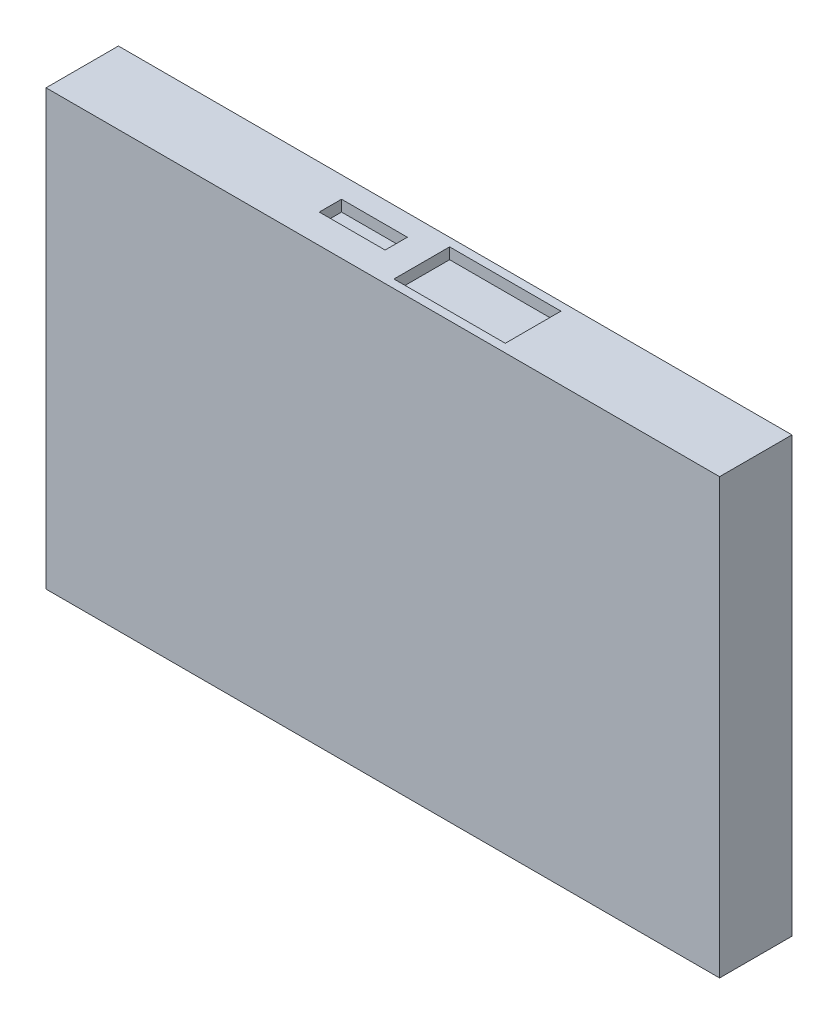
ISO-10303-21;
HEADER;
FILE_DESCRIPTION(('STEP AP214'),'2;1');
FILE_NAME('part.step','',(''),(''),'','','');
FILE_SCHEMA(('AUTOMOTIVE_DESIGN { 1 0 10303 214 1 1 1 1 }'));
ENDSEC;
DATA;
#1=APPLICATION_CONTEXT('core data for automotive mechanical design processes');
#2=APPLICATION_PROTOCOL_DEFINITION('international standard','automotive_design',2000,#1);
#3=PRODUCT_CONTEXT('',#1,'mechanical');
#4=PRODUCT('Part','Part','',(#3));
#5=PRODUCT_RELATED_PRODUCT_CATEGORY('part','',(#4));
#6=PRODUCT_DEFINITION_FORMATION('','',#4);
#7=PRODUCT_DEFINITION_CONTEXT('part definition',#1,'design');
#8=PRODUCT_DEFINITION('design','',#6,#7);
#9=PRODUCT_DEFINITION_SHAPE('','',#8);
#10=(LENGTH_UNIT() NAMED_UNIT(*) SI_UNIT(.MILLI.,.METRE.));
#11=(NAMED_UNIT(*) PLANE_ANGLE_UNIT() SI_UNIT($,.RADIAN.));
#12=(NAMED_UNIT(*) SI_UNIT($,.STERADIAN.) SOLID_ANGLE_UNIT());
#13=UNCERTAINTY_MEASURE_WITH_UNIT(LENGTH_MEASURE(1.E-05),#10,'distance_accuracy_value','');
#14=(GEOMETRIC_REPRESENTATION_CONTEXT(3) GLOBAL_UNCERTAINTY_ASSIGNED_CONTEXT((#13)) GLOBAL_UNIT_ASSIGNED_CONTEXT((#10,
#11,#12)) REPRESENTATION_CONTEXT('',''));
#15=CARTESIAN_POINT('',(0.,0.,0.));
#16=DIRECTION('',(0.,0.,1.));
#17=DIRECTION('',(1.,0.,0.));
#18=AXIS2_PLACEMENT_3D('',#15,#16,#17);
#19=CARTESIAN_POINT('',(0.,0.,13.));
#20=DIRECTION('',(1.,0.,0.));
#21=DIRECTION('',(0.,1.,0.));
#22=AXIS2_PLACEMENT_3D('',#19,#20,#21);
#23=PLANE('',#22);
#24=DIRECTION('',(0.,-1.,0.));
#25=VECTOR('',#24,1.);
#26=CARTESIAN_POINT('',(0.,0.,0.));
#27=LINE('',#26,#25);
#28=CARTESIAN_POINT('',(0.,78.,0.));
#29=VERTEX_POINT('',#28);
#30=CARTESIAN_POINT('',(0.,0.,0.));
#31=VERTEX_POINT('',#30);
#32=EDGE_CURVE('E239',#29,#31,#27,.T.);
#33=ORIENTED_EDGE('',*,*,#32,.T.);
#34=DIRECTION('',(0.,0.,-1.));
#35=VECTOR('',#34,1.);
#36=CARTESIAN_POINT('',(0.,0.,13.));
#37=LINE('',#36,#35);
#38=CARTESIAN_POINT('',(0.,0.,13.));
#39=VERTEX_POINT('',#38);
#40=EDGE_CURVE('E11',#39,#31,#37,.T.);
#41=ORIENTED_EDGE('',*,*,#40,.F.);
#42=DIRECTION('',(0.,-1.,0.));
#43=VECTOR('',#42,1.);
#44=CARTESIAN_POINT('',(0.,0.,13.));
#45=LINE('',#44,#43);
#46=CARTESIAN_POINT('',(0.,78.,13.));
#47=VERTEX_POINT('',#46);
#48=EDGE_CURVE('E246',#47,#39,#45,.T.);
#49=ORIENTED_EDGE('',*,*,#48,.F.);
#50=DIRECTION('',(0.,0.,-1.));
#51=VECTOR('',#50,1.);
#52=CARTESIAN_POINT('',(0.,78.,13.));
#53=LINE('',#52,#51);
#54=EDGE_CURVE('E256',#47,#29,#53,.T.);
#55=ORIENTED_EDGE('',*,*,#54,.T.);
#56=EDGE_LOOP('',(#33,#41,#49,#55));
#57=FACE_BOUND('',#56,.T.);
#58=ADVANCED_FACE('F33',(#57),#23,.F.);
#59=CARTESIAN_POINT('',(0.,0.,13.));
#60=DIRECTION('',(0.,1.,0.));
#61=DIRECTION('',(0.,0.,1.));
#62=AXIS2_PLACEMENT_3D('',#59,#60,#61);
#63=PLANE('',#62);
#64=DIRECTION('',(1.,0.,0.));
#65=VECTOR('',#64,1.);
#66=CARTESIAN_POINT('',(0.,0.,0.));
#67=LINE('',#66,#65);
#68=CARTESIAN_POINT('',(121.,0.,0.));
#69=VERTEX_POINT('',#68);
#70=EDGE_CURVE('E259',#31,#69,#67,.T.);
#71=ORIENTED_EDGE('',*,*,#70,.T.);
#72=DIRECTION('',(0.,0.,-1.));
#73=VECTOR('',#72,1.);
#74=CARTESIAN_POINT('',(121.,0.,13.));
#75=LINE('',#74,#73);
#76=CARTESIAN_POINT('',(121.,0.,13.));
#77=VERTEX_POINT('',#76);
#78=EDGE_CURVE('E40',#77,#69,#75,.T.);
#79=ORIENTED_EDGE('',*,*,#78,.F.);
#80=DIRECTION('',(1.,0.,0.));
#81=VECTOR('',#80,1.);
#82=CARTESIAN_POINT('',(0.,0.,13.));
#83=LINE('',#82,#81);
#84=EDGE_CURVE('E249',#39,#77,#83,.T.);
#85=ORIENTED_EDGE('',*,*,#84,.F.);
#86=ORIENTED_EDGE('',*,*,#40,.T.);
#87=EDGE_LOOP('',(#71,#79,#85,#86));
#88=FACE_BOUND('',#87,.T.);
#89=ADVANCED_FACE('F289',(#88),#63,.F.);
#90=CARTESIAN_POINT('',(121.,0.,13.));
#91=DIRECTION('',(-1.,0.,0.));
#92=DIRECTION('',(0.,-1.,0.));
#93=AXIS2_PLACEMENT_3D('',#90,#91,#92);
#94=PLANE('',#93);
#95=DIRECTION('',(0.,1.,0.));
#96=VECTOR('',#95,1.);
#97=CARTESIAN_POINT('',(121.,0.,0.));
#98=LINE('',#97,#96);
#99=CARTESIAN_POINT('',(121.,78.,0.));
#100=VERTEX_POINT('',#99);
#101=EDGE_CURVE('E261',#69,#100,#98,.T.);
#102=ORIENTED_EDGE('',*,*,#101,.T.);
#103=DIRECTION('',(0.,0.,-1.));
#104=VECTOR('',#103,1.);
#105=CARTESIAN_POINT('',(121.,78.,13.));
#106=LINE('',#105,#104);
#107=CARTESIAN_POINT('',(121.,78.,13.));
#108=VERTEX_POINT('',#107);
#109=EDGE_CURVE('E266',#108,#100,#106,.T.);
#110=ORIENTED_EDGE('',*,*,#109,.F.);
#111=DIRECTION('',(0.,1.,0.));
#112=VECTOR('',#111,1.);
#113=CARTESIAN_POINT('',(121.,0.,13.));
#114=LINE('',#113,#112);
#115=EDGE_CURVE('E252',#77,#108,#114,.T.);
#116=ORIENTED_EDGE('',*,*,#115,.F.);
#117=ORIENTED_EDGE('',*,*,#78,.T.);
#118=EDGE_LOOP('',(#102,#110,#116,#117));
#119=FACE_BOUND('',#118,.T.);
#120=ADVANCED_FACE('F273',(#119),#94,.F.);
#121=CARTESIAN_POINT('',(0.,78.,13.));
#122=DIRECTION('',(0.,-1.,0.));
#123=DIRECTION('',(0.,0.,-1.));
#124=AXIS2_PLACEMENT_3D('',#121,#122,#123);
#125=PLANE('',#124);
#126=DIRECTION('',(-1.,0.,0.));
#127=VECTOR('',#126,1.);
#128=CARTESIAN_POINT('',(55.7032556271098,78.,3.79254612221957));
#129=LINE('',#128,#127);
#130=CARTESIAN_POINT('',(55.7032556271098,78.,3.79254612221957));
#131=VERTEX_POINT('',#130);
#132=CARTESIAN_POINT('',(43.8784487736709,78.,3.79254612221957));
#133=VERTEX_POINT('',#132);
#134=EDGE_CURVE('E174',#131,#133,#129,.T.);
#135=ORIENTED_EDGE('',*,*,#134,.F.);
#136=DIRECTION('',(0.,0.,-1.));
#137=VECTOR('',#136,1.);
#138=CARTESIAN_POINT('',(55.7032556271098,78.,7.78966393183282));
#139=LINE('',#138,#137);
#140=CARTESIAN_POINT('',(55.7032556271098,78.,7.78966393183282));
#141=VERTEX_POINT('',#140);
#142=EDGE_CURVE('E47',#141,#131,#139,.T.);
#143=ORIENTED_EDGE('',*,*,#142,.F.);
#144=DIRECTION('',(1.,0.,0.));
#145=VECTOR('',#144,1.);
#146=CARTESIAN_POINT('',(55.7032556271098,78.,7.78966393183282));
#147=LINE('',#146,#145);
#148=CARTESIAN_POINT('',(43.8784487736709,78.,7.78966393183282));
#149=VERTEX_POINT('',#148);
#150=EDGE_CURVE('E165',#149,#141,#147,.T.);
#151=ORIENTED_EDGE('',*,*,#150,.F.);
#152=DIRECTION('',(0.,0.,1.));
#153=VECTOR('',#152,1.);
#154=CARTESIAN_POINT('',(43.8784487736709,78.,7.78966393183282));
#155=LINE('',#154,#153);
#156=EDGE_CURVE('E168',#133,#149,#155,.T.);
#157=ORIENTED_EDGE('',*,*,#156,.F.);
#158=EDGE_LOOP('',(#135,#143,#151,#157));
#159=FACE_BOUND('',#158,.T.);
#160=DIRECTION('',(-1.,0.,0.));
#161=VECTOR('',#160,1.);
#162=CARTESIAN_POINT('',(81.,78.,1.5));
#163=LINE('',#162,#161);
#164=CARTESIAN_POINT('',(81.,78.,1.5));
#165=VERTEX_POINT('',#164);
#166=CARTESIAN_POINT('',(61.,78.,1.5));
#167=VERTEX_POINT('',#166);
#168=EDGE_CURVE('E198',#165,#167,#163,.T.);
#169=ORIENTED_EDGE('',*,*,#168,.F.);
#170=DIRECTION('',(0.,0.,-1.));
#171=VECTOR('',#170,1.);
#172=CARTESIAN_POINT('',(81.,78.,11.5));
#173=LINE('',#172,#171);
#174=CARTESIAN_POINT('',(81.,78.,11.5));
#175=VERTEX_POINT('',#174);
#176=EDGE_CURVE('E55',#175,#165,#173,.T.);
#177=ORIENTED_EDGE('',*,*,#176,.F.);
#178=DIRECTION('',(1.,0.,0.));
#179=VECTOR('',#178,1.);
#180=CARTESIAN_POINT('',(81.,78.,11.5));
#181=LINE('',#180,#179);
#182=CARTESIAN_POINT('',(61.,78.,11.5));
#183=VERTEX_POINT('',#182);
#184=EDGE_CURVE('E187',#183,#175,#181,.T.);
#185=ORIENTED_EDGE('',*,*,#184,.F.);
#186=DIRECTION('',(0.,0.,1.));
#187=VECTOR('',#186,1.);
#188=CARTESIAN_POINT('',(61.,78.,11.5));
#189=LINE('',#188,#187);
#190=EDGE_CURVE('E201',#167,#183,#189,.T.);
#191=ORIENTED_EDGE('',*,*,#190,.F.);
#192=EDGE_LOOP('',(#169,#177,#185,#191));
#193=FACE_BOUND('',#192,.T.);
#194=DIRECTION('',(-1.,0.,0.));
#195=VECTOR('',#194,1.);
#196=CARTESIAN_POINT('',(0.,78.,0.));
#197=LINE('',#196,#195);
#198=EDGE_CURVE('E250',#100,#29,#197,.T.);
#199=ORIENTED_EDGE('',*,*,#198,.T.);
#200=ORIENTED_EDGE('',*,*,#54,.F.);
#201=DIRECTION('',(-1.,0.,0.));
#202=VECTOR('',#201,1.);
#203=CARTESIAN_POINT('',(0.,78.,13.));
#204=LINE('',#203,#202);
#205=EDGE_CURVE('E254',#108,#47,#204,.T.);
#206=ORIENTED_EDGE('',*,*,#205,.F.);
#207=ORIENTED_EDGE('',*,*,#109,.T.);
#208=EDGE_LOOP('',(#199,#200,#206,#207));
#209=FACE_BOUND('',#208,.T.);
#210=ADVANCED_FACE('F282',(#159,#193,#209),#125,.F.);
#211=CARTESIAN_POINT('',(0.,0.,13.));
#212=DIRECTION('',(0.,0.,-1.));
#213=DIRECTION('',(-1.,0.,0.));
#214=AXIS2_PLACEMENT_3D('',#211,#212,#213);
#215=PLANE('',#214);
#216=ORIENTED_EDGE('',*,*,#48,.T.);
#217=ORIENTED_EDGE('',*,*,#84,.T.);
#218=ORIENTED_EDGE('',*,*,#115,.T.);
#219=ORIENTED_EDGE('',*,*,#205,.T.);
#220=EDGE_LOOP('',(#216,#217,#218,#219));
#221=FACE_BOUND('',#220,.T.);
#222=ADVANCED_FACE('F288',(#221),#215,.F.);
#223=CARTESIAN_POINT('',(0.,0.,0.));
#224=DIRECTION('',(0.,0.,-1.));
#225=DIRECTION('',(-1.,0.,0.));
#226=AXIS2_PLACEMENT_3D('',#223,#224,#225);
#227=PLANE('',#226);
#228=DIRECTION('',(0.,1.,0.));
#229=VECTOR('',#228,1.);
#230=CARTESIAN_POINT('',(2.99999999999999,3.,0.));
#231=LINE('',#230,#229);
#232=CARTESIAN_POINT('',(2.99999999999999,3.,0.));
#233=VERTEX_POINT('',#232);
#234=CARTESIAN_POINT('',(3.,73.,0.));
#235=VERTEX_POINT('',#234);
#236=EDGE_CURVE('E208',#233,#235,#231,.T.);
#237=ORIENTED_EDGE('',*,*,#236,.F.);
#238=DIRECTION('',(-1.,0.,0.));
#239=VECTOR('',#238,1.);
#240=CARTESIAN_POINT('',(2.99999999999999,3.,0.));
#241=LINE('',#240,#239);
#242=CARTESIAN_POINT('',(118.,2.99999999999999,0.));
#243=VERTEX_POINT('',#242);
#244=EDGE_CURVE('E218',#243,#233,#241,.T.);
#245=ORIENTED_EDGE('',*,*,#244,.F.);
#246=DIRECTION('',(0.,-1.,0.));
#247=VECTOR('',#246,1.);
#248=CARTESIAN_POINT('',(118.,2.99999999999999,0.));
#249=LINE('',#248,#247);
#250=CARTESIAN_POINT('',(118.,73.,0.));
#251=VERTEX_POINT('',#250);
#252=EDGE_CURVE('E232',#251,#243,#249,.T.);
#253=ORIENTED_EDGE('',*,*,#252,.F.);
#254=DIRECTION('',(1.,0.,0.));
#255=VECTOR('',#254,1.);
#256=CARTESIAN_POINT('',(3.,73.,0.));
#257=LINE('',#256,#255);
#258=EDGE_CURVE('E229',#235,#251,#257,.T.);
#259=ORIENTED_EDGE('',*,*,#258,.F.);
#260=EDGE_LOOP('',(#237,#245,#253,#259));
#261=FACE_BOUND('',#260,.T.);
#262=ORIENTED_EDGE('',*,*,#32,.F.);
#263=ORIENTED_EDGE('',*,*,#198,.F.);
#264=ORIENTED_EDGE('',*,*,#101,.F.);
#265=ORIENTED_EDGE('',*,*,#70,.F.);
#266=EDGE_LOOP('',(#262,#263,#264,#265));
#267=FACE_BOUND('',#266,.T.);
#268=ADVANCED_FACE('F279',(#261,#267),#227,.T.);
#269=CARTESIAN_POINT('',(2.99999999999999,3.,1.));
#270=DIRECTION('',(-1.,0.,0.));
#271=DIRECTION('',(0.,-1.,0.));
#272=AXIS2_PLACEMENT_3D('',#269,#270,#271);
#273=PLANE('',#272);
#274=ORIENTED_EDGE('',*,*,#236,.T.);
#275=DIRECTION('',(0.,0.,-1.));
#276=VECTOR('',#275,1.);
#277=CARTESIAN_POINT('',(3.,73.,1.));
#278=LINE('',#277,#276);
#279=CARTESIAN_POINT('',(3.,73.,1.));
#280=VERTEX_POINT('',#279);
#281=EDGE_CURVE('E227',#280,#235,#278,.T.);
#282=ORIENTED_EDGE('',*,*,#281,.F.);
#283=DIRECTION('',(0.,1.,0.));
#284=VECTOR('',#283,1.);
#285=CARTESIAN_POINT('',(2.99999999999999,3.,1.));
#286=LINE('',#285,#284);
#287=CARTESIAN_POINT('',(2.99999999999999,3.,1.));
#288=VERTEX_POINT('',#287);
#289=EDGE_CURVE('E214',#288,#280,#286,.T.);
#290=ORIENTED_EDGE('',*,*,#289,.F.);
#291=DIRECTION('',(0.,0.,-1.));
#292=VECTOR('',#291,1.);
#293=CARTESIAN_POINT('',(2.99999999999999,3.,1.));
#294=LINE('',#293,#292);
#295=EDGE_CURVE('E237',#288,#233,#294,.T.);
#296=ORIENTED_EDGE('',*,*,#295,.T.);
#297=EDGE_LOOP('',(#274,#282,#290,#296));
#298=FACE_BOUND('',#297,.T.);
#299=ADVANCED_FACE('F302',(#298),#273,.F.);
#300=CARTESIAN_POINT('',(2.99999999999999,3.,1.));
#301=DIRECTION('',(0.,-1.,0.));
#302=DIRECTION('',(1.,0.,0.));
#303=AXIS2_PLACEMENT_3D('',#300,#301,#302);
#304=PLANE('',#303);
#305=ORIENTED_EDGE('',*,*,#244,.T.);
#306=ORIENTED_EDGE('',*,*,#295,.F.);
#307=DIRECTION('',(-1.,0.,0.));
#308=VECTOR('',#307,1.);
#309=CARTESIAN_POINT('',(2.99999999999999,3.,1.));
#310=LINE('',#309,#308);
#311=CARTESIAN_POINT('',(118.,2.99999999999999,1.));
#312=VERTEX_POINT('',#311);
#313=EDGE_CURVE('E224',#312,#288,#310,.T.);
#314=ORIENTED_EDGE('',*,*,#313,.F.);
#315=DIRECTION('',(0.,0.,-1.));
#316=VECTOR('',#315,1.);
#317=CARTESIAN_POINT('',(118.,2.99999999999999,1.));
#318=LINE('',#317,#316);
#319=EDGE_CURVE('E240',#312,#243,#318,.T.);
#320=ORIENTED_EDGE('',*,*,#319,.T.);
#321=EDGE_LOOP('',(#305,#306,#314,#320));
#322=FACE_BOUND('',#321,.T.);
#323=ADVANCED_FACE('F308',(#322),#304,.F.);
#324=CARTESIAN_POINT('',(118.,2.99999999999999,1.));
#325=DIRECTION('',(1.,0.,0.));
#326=DIRECTION('',(0.,0.,-1.));
#327=AXIS2_PLACEMENT_3D('',#324,#325,#326);
#328=PLANE('',#327);
#329=ORIENTED_EDGE('',*,*,#252,.T.);
#330=ORIENTED_EDGE('',*,*,#319,.F.);
#331=DIRECTION('',(0.,-1.,0.));
#332=VECTOR('',#331,1.);
#333=CARTESIAN_POINT('',(118.,2.99999999999999,1.));
#334=LINE('',#333,#332);
#335=CARTESIAN_POINT('',(118.,73.,1.));
#336=VERTEX_POINT('',#335);
#337=EDGE_CURVE('E221',#336,#312,#334,.T.);
#338=ORIENTED_EDGE('',*,*,#337,.F.);
#339=DIRECTION('',(0.,0.,-1.));
#340=VECTOR('',#339,1.);
#341=CARTESIAN_POINT('',(118.,73.,1.));
#342=LINE('',#341,#340);
#343=EDGE_CURVE('E242',#336,#251,#342,.T.);
#344=ORIENTED_EDGE('',*,*,#343,.T.);
#345=EDGE_LOOP('',(#329,#330,#338,#344));
#346=FACE_BOUND('',#345,.T.);
#347=ADVANCED_FACE('F314',(#346),#328,.F.);
#348=CARTESIAN_POINT('',(3.,73.,1.));
#349=DIRECTION('',(0.,1.,0.));
#350=DIRECTION('',(-1.,0.,0.));
#351=AXIS2_PLACEMENT_3D('',#348,#349,#350);
#352=PLANE('',#351);
#353=ORIENTED_EDGE('',*,*,#258,.T.);
#354=ORIENTED_EDGE('',*,*,#343,.F.);
#355=DIRECTION('',(1.,0.,0.));
#356=VECTOR('',#355,1.);
#357=CARTESIAN_POINT('',(3.,73.,1.));
#358=LINE('',#357,#356);
#359=EDGE_CURVE('E217',#280,#336,#358,.T.);
#360=ORIENTED_EDGE('',*,*,#359,.F.);
#361=ORIENTED_EDGE('',*,*,#281,.T.);
#362=EDGE_LOOP('',(#353,#354,#360,#361));
#363=FACE_BOUND('',#362,.T.);
#364=ADVANCED_FACE('F310',(#363),#352,.F.);
#365=CARTESIAN_POINT('',(0.,0.,1.));
#366=DIRECTION('',(0.,0.,-1.));
#367=DIRECTION('',(-1.,0.,0.));
#368=AXIS2_PLACEMENT_3D('',#365,#366,#367);
#369=PLANE('',#368);
#370=ORIENTED_EDGE('',*,*,#289,.T.);
#371=ORIENTED_EDGE('',*,*,#359,.T.);
#372=ORIENTED_EDGE('',*,*,#337,.T.);
#373=ORIENTED_EDGE('',*,*,#313,.T.);
#374=EDGE_LOOP('',(#370,#371,#372,#373));
#375=FACE_BOUND('',#374,.T.);
#376=ADVANCED_FACE('F313',(#375),#369,.T.);
#377=CARTESIAN_POINT('',(81.,76.,11.5));
#378=DIRECTION('',(1.,0.,0.));
#379=DIRECTION('',(0.,0.,-1.));
#380=AXIS2_PLACEMENT_3D('',#377,#378,#379);
#381=PLANE('',#380);
#382=ORIENTED_EDGE('',*,*,#176,.T.);
#383=DIRECTION('',(0.,1.,0.));
#384=VECTOR('',#383,1.);
#385=CARTESIAN_POINT('',(81.,76.,1.5));
#386=LINE('',#385,#384);
#387=CARTESIAN_POINT('',(81.,76.,1.5));
#388=VERTEX_POINT('',#387);
#389=EDGE_CURVE('E196',#388,#165,#386,.T.);
#390=ORIENTED_EDGE('',*,*,#389,.F.);
#391=DIRECTION('',(0.,0.,-1.));
#392=VECTOR('',#391,1.);
#393=CARTESIAN_POINT('',(81.,76.,11.5));
#394=LINE('',#393,#392);
#395=CARTESIAN_POINT('',(81.,76.,11.5));
#396=VERTEX_POINT('',#395);
#397=EDGE_CURVE('E183',#396,#388,#394,.T.);
#398=ORIENTED_EDGE('',*,*,#397,.F.);
#399=DIRECTION('',(0.,1.,0.));
#400=VECTOR('',#399,1.);
#401=CARTESIAN_POINT('',(81.,76.,11.5));
#402=LINE('',#401,#400);
#403=EDGE_CURVE('E206',#396,#175,#402,.T.);
#404=ORIENTED_EDGE('',*,*,#403,.T.);
#405=EDGE_LOOP('',(#382,#390,#398,#404));
#406=FACE_BOUND('',#405,.T.);
#407=ADVANCED_FACE('F324',(#406),#381,.F.);
#408=CARTESIAN_POINT('',(81.,76.,11.5));
#409=DIRECTION('',(0.,0.,1.));
#410=DIRECTION('',(1.,0.,0.));
#411=AXIS2_PLACEMENT_3D('',#408,#409,#410);
#412=PLANE('',#411);
#413=ORIENTED_EDGE('',*,*,#184,.T.);
#414=ORIENTED_EDGE('',*,*,#403,.F.);
#415=DIRECTION('',(1.,0.,0.));
#416=VECTOR('',#415,1.);
#417=CARTESIAN_POINT('',(81.,76.,11.5));
#418=LINE('',#417,#416);
#419=CARTESIAN_POINT('',(61.,76.,11.5));
#420=VERTEX_POINT('',#419);
#421=EDGE_CURVE('E193',#420,#396,#418,.T.);
#422=ORIENTED_EDGE('',*,*,#421,.F.);
#423=DIRECTION('',(0.,1.,0.));
#424=VECTOR('',#423,1.);
#425=CARTESIAN_POINT('',(61.,76.,11.5));
#426=LINE('',#425,#424);
#427=EDGE_CURVE('E209',#420,#183,#426,.T.);
#428=ORIENTED_EDGE('',*,*,#427,.T.);
#429=EDGE_LOOP('',(#413,#414,#422,#428));
#430=FACE_BOUND('',#429,.T.);
#431=ADVANCED_FACE('F328',(#430),#412,.F.);
#432=CARTESIAN_POINT('',(61.,76.,11.5));
#433=DIRECTION('',(-1.,0.,0.));
#434=DIRECTION('',(0.,0.,1.));
#435=AXIS2_PLACEMENT_3D('',#432,#433,#434);
#436=PLANE('',#435);
#437=ORIENTED_EDGE('',*,*,#190,.T.);
#438=ORIENTED_EDGE('',*,*,#427,.F.);
#439=DIRECTION('',(0.,0.,1.));
#440=VECTOR('',#439,1.);
#441=CARTESIAN_POINT('',(61.,76.,11.5));
#442=LINE('',#441,#440);
#443=CARTESIAN_POINT('',(61.,76.,1.5));
#444=VERTEX_POINT('',#443);
#445=EDGE_CURVE('E190',#444,#420,#442,.T.);
#446=ORIENTED_EDGE('',*,*,#445,.F.);
#447=DIRECTION('',(0.,1.,0.));
#448=VECTOR('',#447,1.);
#449=CARTESIAN_POINT('',(61.,76.,1.5));
#450=LINE('',#449,#448);
#451=EDGE_CURVE('E211',#444,#167,#450,.T.);
#452=ORIENTED_EDGE('',*,*,#451,.T.);
#453=EDGE_LOOP('',(#437,#438,#446,#452));
#454=FACE_BOUND('',#453,.T.);
#455=ADVANCED_FACE('F333',(#454),#436,.F.);
#456=CARTESIAN_POINT('',(81.,76.,1.5));
#457=DIRECTION('',(0.,0.,-1.));
#458=DIRECTION('',(-1.,0.,0.));
#459=AXIS2_PLACEMENT_3D('',#456,#457,#458);
#460=PLANE('',#459);
#461=ORIENTED_EDGE('',*,*,#168,.T.);
#462=ORIENTED_EDGE('',*,*,#451,.F.);
#463=DIRECTION('',(-1.,0.,0.));
#464=VECTOR('',#463,1.);
#465=CARTESIAN_POINT('',(81.,76.,1.5));
#466=LINE('',#465,#464);
#467=EDGE_CURVE('E186',#388,#444,#466,.T.);
#468=ORIENTED_EDGE('',*,*,#467,.F.);
#469=ORIENTED_EDGE('',*,*,#389,.T.);
#470=EDGE_LOOP('',(#461,#462,#468,#469));
#471=FACE_BOUND('',#470,.T.);
#472=ADVANCED_FACE('F329',(#471),#460,.F.);
#473=CARTESIAN_POINT('',(0.,76.,0.));
#474=DIRECTION('',(0.,1.,0.));
#475=DIRECTION('',(0.,0.,1.));
#476=AXIS2_PLACEMENT_3D('',#473,#474,#475);
#477=PLANE('',#476);
#478=ORIENTED_EDGE('',*,*,#397,.T.);
#479=ORIENTED_EDGE('',*,*,#467,.T.);
#480=ORIENTED_EDGE('',*,*,#445,.T.);
#481=ORIENTED_EDGE('',*,*,#421,.T.);
#482=EDGE_LOOP('',(#478,#479,#480,#481));
#483=FACE_BOUND('',#482,.T.);
#484=ADVANCED_FACE('F332',(#483),#477,.T.);
#485=CARTESIAN_POINT('',(55.7032556271098,76.,7.78966393183282));
#486=DIRECTION('',(1.,0.,0.));
#487=DIRECTION('',(0.,0.,-1.));
#488=AXIS2_PLACEMENT_3D('',#485,#486,#487);
#489=PLANE('',#488);
#490=ORIENTED_EDGE('',*,*,#142,.T.);
#491=DIRECTION('',(0.,1.,0.));
#492=VECTOR('',#491,1.);
#493=CARTESIAN_POINT('',(55.7032556271098,76.,3.79254612221957));
#494=LINE('',#493,#492);
#495=CARTESIAN_POINT('',(55.7032556271098,76.,3.79254612221957));
#496=VERTEX_POINT('',#495);
#497=EDGE_CURVE('E143',#496,#131,#494,.T.);
#498=ORIENTED_EDGE('',*,*,#497,.F.);
#499=DIRECTION('',(0.,0.,-1.));
#500=VECTOR('',#499,1.);
#501=CARTESIAN_POINT('',(55.7032556271098,76.,7.78966393183282));
#502=LINE('',#501,#500);
#503=CARTESIAN_POINT('',(55.7032556271098,76.,7.78966393183282));
#504=VERTEX_POINT('',#503);
#505=EDGE_CURVE('E147',#504,#496,#502,.T.);
#506=ORIENTED_EDGE('',*,*,#505,.F.);
#507=DIRECTION('',(0.,1.,0.));
#508=VECTOR('',#507,1.);
#509=CARTESIAN_POINT('',(55.7032556271098,76.,7.78966393183282));
#510=LINE('',#509,#508);
#511=EDGE_CURVE('E178',#504,#141,#510,.T.);
#512=ORIENTED_EDGE('',*,*,#511,.T.);
#513=EDGE_LOOP('',(#490,#498,#506,#512));
#514=FACE_BOUND('',#513,.T.);
#515=ADVANCED_FACE('F145',(#514),#489,.F.);
#516=CARTESIAN_POINT('',(55.7032556271098,76.,7.78966393183282));
#517=DIRECTION('',(0.,0.,1.));
#518=DIRECTION('',(1.,0.,0.));
#519=AXIS2_PLACEMENT_3D('',#516,#517,#518);
#520=PLANE('',#519);
#521=ORIENTED_EDGE('',*,*,#150,.T.);
#522=ORIENTED_EDGE('',*,*,#511,.F.);
#523=DIRECTION('',(1.,0.,0.));
#524=VECTOR('',#523,1.);
#525=CARTESIAN_POINT('',(55.7032556271098,76.,7.78966393183282));
#526=LINE('',#525,#524);
#527=CARTESIAN_POINT('',(43.8784487736709,76.,7.78966393183282));
#528=VERTEX_POINT('',#527);
#529=EDGE_CURVE('E153',#528,#504,#526,.T.);
#530=ORIENTED_EDGE('',*,*,#529,.F.);
#531=DIRECTION('',(0.,1.,0.));
#532=VECTOR('',#531,1.);
#533=CARTESIAN_POINT('',(43.8784487736709,76.,7.78966393183282));
#534=LINE('',#533,#532);
#535=EDGE_CURVE('E180',#528,#149,#534,.T.);
#536=ORIENTED_EDGE('',*,*,#535,.T.);
#537=EDGE_LOOP('',(#521,#522,#530,#536));
#538=FACE_BOUND('',#537,.T.);
#539=ADVANCED_FACE('F346',(#538),#520,.F.);
#540=CARTESIAN_POINT('',(43.8784487736709,76.,7.78966393183282));
#541=DIRECTION('',(-1.,0.,0.));
#542=DIRECTION('',(0.,0.,1.));
#543=AXIS2_PLACEMENT_3D('',#540,#541,#542);
#544=PLANE('',#543);
#545=ORIENTED_EDGE('',*,*,#156,.T.);
#546=ORIENTED_EDGE('',*,*,#535,.F.);
#547=DIRECTION('',(0.,0.,1.));
#548=VECTOR('',#547,1.);
#549=CARTESIAN_POINT('',(43.8784487736709,76.,7.78966393183282));
#550=LINE('',#549,#548);
#551=CARTESIAN_POINT('',(43.8784487736709,76.,3.79254612221957));
#552=VERTEX_POINT('',#551);
#553=EDGE_CURVE('E161',#552,#528,#550,.T.);
#554=ORIENTED_EDGE('',*,*,#553,.F.);
#555=DIRECTION('',(0.,1.,0.));
#556=VECTOR('',#555,1.);
#557=CARTESIAN_POINT('',(43.8784487736709,76.,3.79254612221957));
#558=LINE('',#557,#556);
#559=EDGE_CURVE('E152',#552,#133,#558,.T.);
#560=ORIENTED_EDGE('',*,*,#559,.T.);
#561=EDGE_LOOP('',(#545,#546,#554,#560));
#562=FACE_BOUND('',#561,.T.);
#563=ADVANCED_FACE('F349',(#562),#544,.F.);
#564=CARTESIAN_POINT('',(55.7032556271098,76.,3.79254612221957));
#565=DIRECTION('',(0.,0.,-1.));
#566=DIRECTION('',(-1.,0.,0.));
#567=AXIS2_PLACEMENT_3D('',#564,#565,#566);
#568=PLANE('',#567);
#569=ORIENTED_EDGE('',*,*,#134,.T.);
#570=ORIENTED_EDGE('',*,*,#559,.F.);
#571=DIRECTION('',(-1.,0.,0.));
#572=VECTOR('',#571,1.);
#573=CARTESIAN_POINT('',(55.7032556271098,76.,3.79254612221957));
#574=LINE('',#573,#572);
#575=EDGE_CURVE('E156',#496,#552,#574,.T.);
#576=ORIENTED_EDGE('',*,*,#575,.F.);
#577=ORIENTED_EDGE('',*,*,#497,.T.);
#578=EDGE_LOOP('',(#569,#570,#576,#577));
#579=FACE_BOUND('',#578,.T.);
#580=ADVANCED_FACE('F157',(#579),#568,.F.);
#581=CARTESIAN_POINT('',(0.,76.,0.));
#582=DIRECTION('',(0.,1.,0.));
#583=DIRECTION('',(0.,0.,1.));
#584=AXIS2_PLACEMENT_3D('',#581,#582,#583);
#585=PLANE('',#584);
#586=ORIENTED_EDGE('',*,*,#505,.T.);
#587=ORIENTED_EDGE('',*,*,#575,.T.);
#588=ORIENTED_EDGE('',*,*,#553,.T.);
#589=ORIENTED_EDGE('',*,*,#529,.T.);
#590=EDGE_LOOP('',(#586,#587,#588,#589));
#591=FACE_BOUND('',#590,.T.);
#592=ADVANCED_FACE('F163',(#591),#585,.T.);
#593=CLOSED_SHELL('',(#58,#89,#120,#210,#222,#268,#299,#323,#347,#364,#376,#407,#431,#455,#472,
#484,#515,#539,#563,#580,#592));
#594=MANIFOLD_SOLID_BREP('B2',#593);
#595=ADVANCED_BREP_SHAPE_REPRESENTATION('',(#18,#594),#14);
#596=SHAPE_DEFINITION_REPRESENTATION(#9,#595);
ENDSEC;
END-ISO-10303-21;
